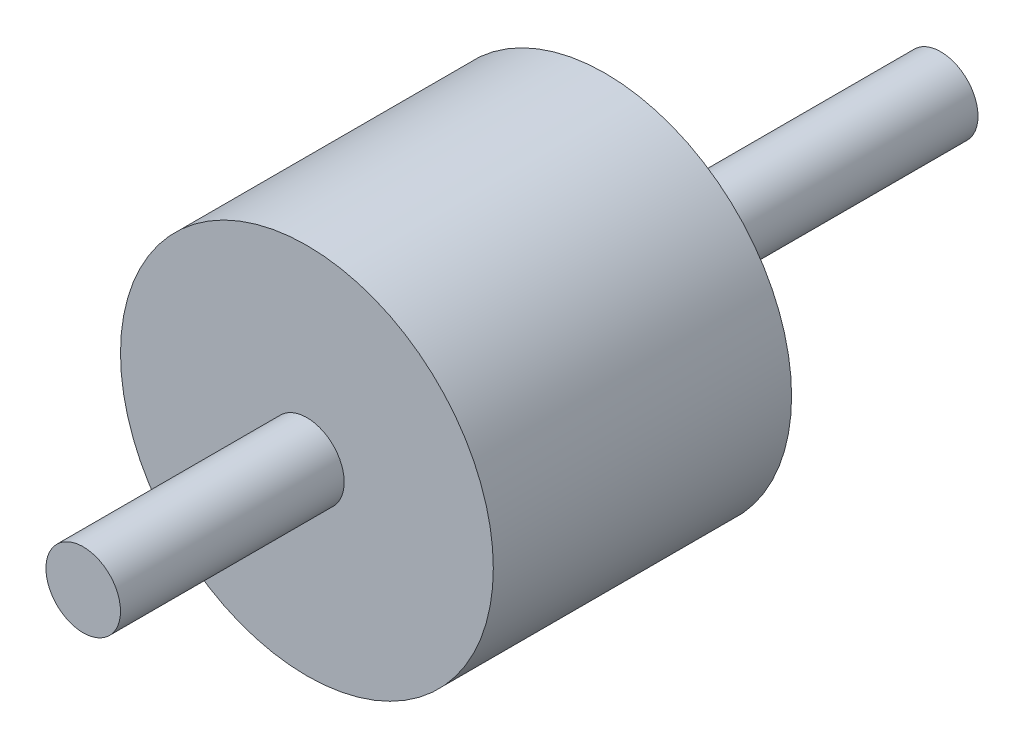
ISO-10303-21;
HEADER;
FILE_DESCRIPTION(('STEP AP214'),'2;1');
FILE_NAME('part.step','',(''),(''),'','','');
FILE_SCHEMA(('AUTOMOTIVE_DESIGN { 1 0 10303 214 1 1 1 1 }'));
ENDSEC;
DATA;
#1=APPLICATION_CONTEXT('core data for automotive mechanical design processes');
#2=APPLICATION_PROTOCOL_DEFINITION('international standard','automotive_design',2000,#1);
#3=PRODUCT_CONTEXT('',#1,'mechanical');
#4=PRODUCT('Part','Part','',(#3));
#5=PRODUCT_RELATED_PRODUCT_CATEGORY('part','',(#4));
#6=PRODUCT_DEFINITION_FORMATION('','',#4);
#7=PRODUCT_DEFINITION_CONTEXT('part definition',#1,'design');
#8=PRODUCT_DEFINITION('design','',#6,#7);
#9=PRODUCT_DEFINITION_SHAPE('','',#8);
#10=(LENGTH_UNIT() NAMED_UNIT(*) SI_UNIT(.MILLI.,.METRE.));
#11=(NAMED_UNIT(*) PLANE_ANGLE_UNIT() SI_UNIT($,.RADIAN.));
#12=(NAMED_UNIT(*) SI_UNIT($,.STERADIAN.) SOLID_ANGLE_UNIT());
#13=UNCERTAINTY_MEASURE_WITH_UNIT(LENGTH_MEASURE(1.E-05),#10,'distance_accuracy_value','');
#14=(GEOMETRIC_REPRESENTATION_CONTEXT(3) GLOBAL_UNCERTAINTY_ASSIGNED_CONTEXT((#13)) GLOBAL_UNIT_ASSIGNED_CONTEXT((#10,
#11,#12)) REPRESENTATION_CONTEXT('',''));
#15=CARTESIAN_POINT('',(0.,0.,0.));
#16=DIRECTION('',(0.,0.,1.));
#17=DIRECTION('',(1.,0.,0.));
#18=AXIS2_PLACEMENT_3D('',#15,#16,#17);
#19=CARTESIAN_POINT('',(0.,0.,40.));
#20=DIRECTION('',(0.,0.,-1.));
#21=DIRECTION('',(-1.,0.,0.));
#22=AXIS2_PLACEMENT_3D('',#19,#20,#21);
#23=CYLINDRICAL_SURFACE('',#22,25.);
#24=CARTESIAN_POINT('',(0.,0.,40.));
#25=DIRECTION('',(0.,0.,1.));
#26=DIRECTION('',(1.,0.,0.));
#27=AXIS2_PLACEMENT_3D('',#24,#25,#26);
#28=CIRCLE('',#27,25.);
#29=CARTESIAN_POINT('',(25.,0.,40.));
#30=VERTEX_POINT('',#29);
#31=EDGE_CURVE('E44',#30,#30,#28,.T.);
#32=ORIENTED_EDGE('',*,*,#31,.F.);
#33=EDGE_LOOP('',(#32));
#34=FACE_BOUND('',#33,.T.);
#35=CARTESIAN_POINT('',(0.,0.,0.));
#36=DIRECTION('',(0.,0.,1.));
#37=DIRECTION('',(1.,0.,0.));
#38=AXIS2_PLACEMENT_3D('',#35,#36,#37);
#39=CIRCLE('',#38,25.);
#40=CARTESIAN_POINT('',(25.,0.,0.));
#41=VERTEX_POINT('',#40);
#42=EDGE_CURVE('E40',#41,#41,#39,.T.);
#43=ORIENTED_EDGE('',*,*,#42,.T.);
#44=EDGE_LOOP('',(#43));
#45=FACE_BOUND('',#44,.T.);
#46=ADVANCED_FACE('F37',(#34,#45),#23,.T.);
#47=CARTESIAN_POINT('',(0.,0.,40.));
#48=DIRECTION('',(0.,0.,1.));
#49=DIRECTION('',(1.,0.,0.));
#50=AXIS2_PLACEMENT_3D('',#47,#48,#49);
#51=PLANE('',#50);
#52=CARTESIAN_POINT('',(0.,0.,40.));
#53=DIRECTION('',(0.,0.,1.));
#54=DIRECTION('',(1.,0.,0.));
#55=AXIS2_PLACEMENT_3D('',#52,#53,#54);
#56=CIRCLE('',#55,5.);
#57=CARTESIAN_POINT('',(5.,0.,40.));
#58=VERTEX_POINT('',#57);
#59=EDGE_CURVE('E10',#58,#58,#56,.T.);
#60=ORIENTED_EDGE('',*,*,#59,.F.);
#61=EDGE_LOOP('',(#60));
#62=FACE_BOUND('',#61,.T.);
#63=ORIENTED_EDGE('',*,*,#31,.T.);
#64=EDGE_LOOP('',(#63));
#65=FACE_BOUND('',#64,.T.);
#66=ADVANCED_FACE('F84',(#62,#65),#51,.T.);
#67=CARTESIAN_POINT('',(0.,0.,0.));
#68=DIRECTION('',(0.,0.,1.));
#69=DIRECTION('',(1.,0.,0.));
#70=AXIS2_PLACEMENT_3D('',#67,#68,#69);
#71=PLANE('',#70);
#72=CARTESIAN_POINT('',(0.,0.,0.));
#73=DIRECTION('',(0.,0.,1.));
#74=DIRECTION('',(1.,0.,0.));
#75=AXIS2_PLACEMENT_3D('',#72,#73,#74);
#76=CIRCLE('',#75,7.5);
#77=CARTESIAN_POINT('',(7.5,0.,0.));
#78=VERTEX_POINT('',#77);
#79=EDGE_CURVE('E56',#78,#78,#76,.T.);
#80=ORIENTED_EDGE('',*,*,#79,.T.);
#81=EDGE_LOOP('',(#80));
#82=FACE_BOUND('',#81,.T.);
#83=ORIENTED_EDGE('',*,*,#42,.F.);
#84=EDGE_LOOP('',(#83));
#85=FACE_BOUND('',#84,.T.);
#86=ADVANCED_FACE('F90',(#82,#85),#71,.F.);
#87=CARTESIAN_POINT('',(0.,0.,-10.));
#88=DIRECTION('',(0.,0.,1.));
#89=DIRECTION('',(1.,0.,0.));
#90=AXIS2_PLACEMENT_3D('',#87,#88,#89);
#91=CYLINDRICAL_SURFACE('',#90,7.5);
#92=CARTESIAN_POINT('',(0.,0.,-10.));
#93=DIRECTION('',(0.,0.,1.));
#94=DIRECTION('',(1.,0.,0.));
#95=AXIS2_PLACEMENT_3D('',#92,#93,#94);
#96=CIRCLE('',#95,7.5);
#97=CARTESIAN_POINT('',(7.5,0.,-10.));
#98=VERTEX_POINT('',#97);
#99=EDGE_CURVE('E53',#98,#98,#96,.T.);
#100=ORIENTED_EDGE('',*,*,#99,.T.);
#101=EDGE_LOOP('',(#100));
#102=FACE_BOUND('',#101,.T.);
#103=ORIENTED_EDGE('',*,*,#79,.F.);
#104=EDGE_LOOP('',(#103));
#105=FACE_BOUND('',#104,.T.);
#106=ADVANCED_FACE('F98',(#102,#105),#91,.T.);
#107=CARTESIAN_POINT('',(0.,0.,-10.));
#108=DIRECTION('',(0.,0.,1.));
#109=DIRECTION('',(1.,0.,0.));
#110=AXIS2_PLACEMENT_3D('',#107,#108,#109);
#111=PLANE('',#110);
#112=CARTESIAN_POINT('',(0.,0.,-10.));
#113=DIRECTION('',(0.,0.,1.));
#114=DIRECTION('',(1.,0.,0.));
#115=AXIS2_PLACEMENT_3D('',#112,#113,#114);
#116=CIRCLE('',#115,5.);
#117=CARTESIAN_POINT('',(5.,0.,-10.));
#118=VERTEX_POINT('',#117);
#119=EDGE_CURVE('E61',#118,#118,#116,.T.);
#120=ORIENTED_EDGE('',*,*,#119,.T.);
#121=EDGE_LOOP('',(#120));
#122=FACE_BOUND('',#121,.T.);
#123=ORIENTED_EDGE('',*,*,#99,.F.);
#124=EDGE_LOOP('',(#123));
#125=FACE_BOUND('',#124,.T.);
#126=ADVANCED_FACE('F102',(#122,#125),#111,.F.);
#127=CARTESIAN_POINT('',(0.,0.,70.));
#128=DIRECTION('',(0.,0.,-1.));
#129=DIRECTION('',(-1.,0.,0.));
#130=AXIS2_PLACEMENT_3D('',#127,#128,#129);
#131=CYLINDRICAL_SURFACE('',#130,5.);
#132=CARTESIAN_POINT('',(0.,0.,70.));
#133=DIRECTION('',(0.,0.,1.));
#134=DIRECTION('',(1.,0.,0.));
#135=AXIS2_PLACEMENT_3D('',#132,#133,#134);
#136=CIRCLE('',#135,5.);
#137=CARTESIAN_POINT('',(5.,0.,70.));
#138=VERTEX_POINT('',#137);
#139=EDGE_CURVE('E51',#138,#138,#136,.T.);
#140=ORIENTED_EDGE('',*,*,#139,.F.);
#141=EDGE_LOOP('',(#140));
#142=FACE_BOUND('',#141,.T.);
#143=ORIENTED_EDGE('',*,*,#59,.T.);
#144=EDGE_LOOP('',(#143));
#145=FACE_BOUND('',#144,.T.);
#146=ADVANCED_FACE('F108',(#142,#145),#131,.T.);
#147=CARTESIAN_POINT('',(0.,0.,70.));
#148=DIRECTION('',(0.,0.,1.));
#149=DIRECTION('',(1.,0.,0.));
#150=AXIS2_PLACEMENT_3D('',#147,#148,#149);
#151=PLANE('',#150);
#152=ORIENTED_EDGE('',*,*,#139,.T.);
#153=EDGE_LOOP('',(#152));
#154=FACE_BOUND('',#153,.T.);
#155=ADVANCED_FACE('F81',(#154),#151,.T.);
#156=CARTESIAN_POINT('',(0.,0.,-45.));
#157=DIRECTION('',(0.,0.,1.));
#158=DIRECTION('',(1.,0.,0.));
#159=AXIS2_PLACEMENT_3D('',#156,#157,#158);
#160=CYLINDRICAL_SURFACE('',#159,5.);
#161=CARTESIAN_POINT('',(0.,0.,-45.));
#162=DIRECTION('',(0.,0.,1.));
#163=DIRECTION('',(1.,0.,0.));
#164=AXIS2_PLACEMENT_3D('',#161,#162,#163);
#165=CIRCLE('',#164,5.);
#166=CARTESIAN_POINT('',(5.,0.,-45.));
#167=VERTEX_POINT('',#166);
#168=EDGE_CURVE('E65',#167,#167,#165,.T.);
#169=ORIENTED_EDGE('',*,*,#168,.T.);
#170=EDGE_LOOP('',(#169));
#171=FACE_BOUND('',#170,.T.);
#172=ORIENTED_EDGE('',*,*,#119,.F.);
#173=EDGE_LOOP('',(#172));
#174=FACE_BOUND('',#173,.T.);
#175=ADVANCED_FACE('F72',(#171,#174),#160,.T.);
#176=CARTESIAN_POINT('',(0.,0.,-45.));
#177=DIRECTION('',(0.,0.,1.));
#178=DIRECTION('',(1.,0.,0.));
#179=AXIS2_PLACEMENT_3D('',#176,#177,#178);
#180=PLANE('',#179);
#181=ORIENTED_EDGE('',*,*,#168,.F.);
#182=EDGE_LOOP('',(#181));
#183=FACE_BOUND('',#182,.T.);
#184=ADVANCED_FACE('F75',(#183),#180,.F.);
#185=CLOSED_SHELL('',(#46,#66,#86,#106,#126,#146,#155,#175,#184));
#186=MANIFOLD_SOLID_BREP('B2',#185);
#187=ADVANCED_BREP_SHAPE_REPRESENTATION('',(#18,#186),#14);
#188=SHAPE_DEFINITION_REPRESENTATION(#9,#187);
ENDSEC;
END-ISO-10303-21;
